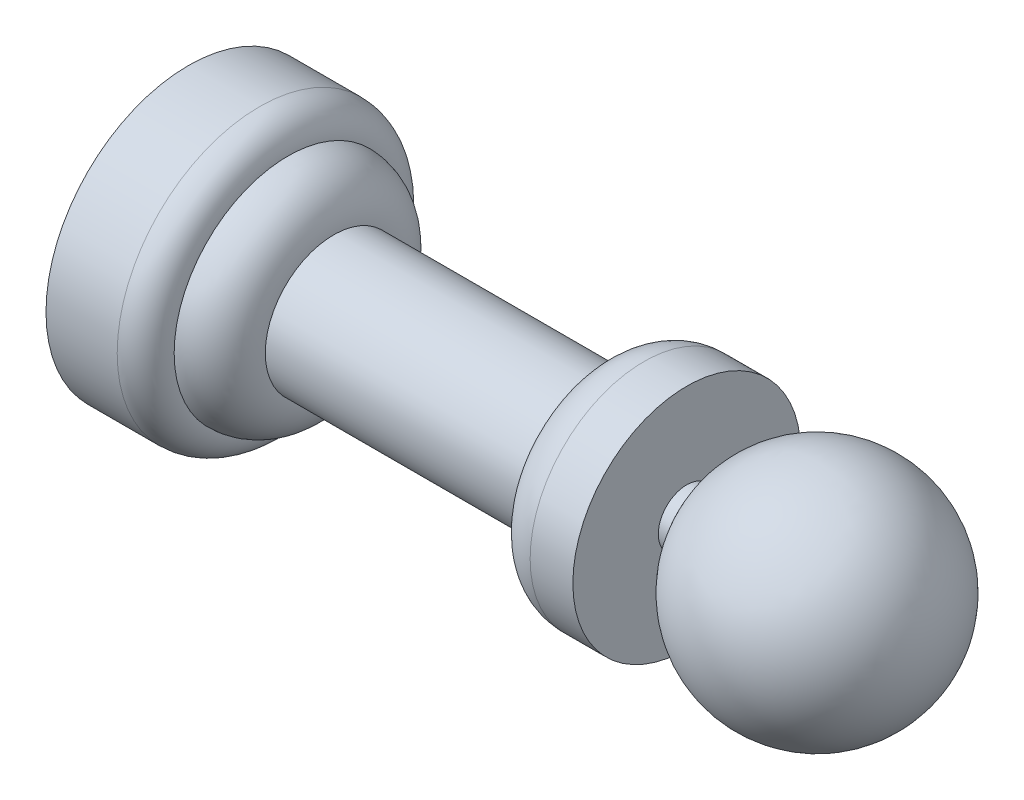
ISO-10303-21;
HEADER;
FILE_DESCRIPTION(('STEP AP214'),'2;1');
FILE_NAME('part.step','',(''),(''),'','','');
FILE_SCHEMA(('AUTOMOTIVE_DESIGN { 1 0 10303 214 1 1 1 1 }'));
ENDSEC;
DATA;
#1=APPLICATION_CONTEXT('core data for automotive mechanical design processes');
#2=APPLICATION_PROTOCOL_DEFINITION('international standard','automotive_design',2000,#1);
#3=PRODUCT_CONTEXT('',#1,'mechanical');
#4=PRODUCT('Part','Part','',(#3));
#5=PRODUCT_RELATED_PRODUCT_CATEGORY('part','',(#4));
#6=PRODUCT_DEFINITION_FORMATION('','',#4);
#7=PRODUCT_DEFINITION_CONTEXT('part definition',#1,'design');
#8=PRODUCT_DEFINITION('design','',#6,#7);
#9=PRODUCT_DEFINITION_SHAPE('','',#8);
#10=(LENGTH_UNIT() NAMED_UNIT(*) SI_UNIT(.MILLI.,.METRE.));
#11=(NAMED_UNIT(*) PLANE_ANGLE_UNIT() SI_UNIT($,.RADIAN.));
#12=(NAMED_UNIT(*) SI_UNIT($,.STERADIAN.) SOLID_ANGLE_UNIT());
#13=UNCERTAINTY_MEASURE_WITH_UNIT(LENGTH_MEASURE(1.E-05),#10,'distance_accuracy_value','');
#14=(GEOMETRIC_REPRESENTATION_CONTEXT(3) GLOBAL_UNCERTAINTY_ASSIGNED_CONTEXT((#13)) GLOBAL_UNIT_ASSIGNED_CONTEXT((#10,
#11,#12)) REPRESENTATION_CONTEXT('',''));
#15=CARTESIAN_POINT('',(0.,0.,0.));
#16=DIRECTION('',(0.,0.,1.));
#17=DIRECTION('',(1.,0.,0.));
#18=AXIS2_PLACEMENT_3D('',#15,#16,#17);
#19=CARTESIAN_POINT('',(32.,0.,0.));
#20=DIRECTION('',(-1.,0.,0.));
#21=DIRECTION('',(0.,0.,1.));
#22=AXIS2_PLACEMENT_3D('',#19,#20,#21);
#23=TOROIDAL_SURFACE('',#22,4.8,3.2);
#24=CARTESIAN_POINT('',(32.,0.,0.));
#25=DIRECTION('',(-1.,0.,0.));
#26=DIRECTION('',(0.,0.,1.));
#27=AXIS2_PLACEMENT_3D('',#24,#25,#26);
#28=CIRCLE('',#27,8.);
#29=CARTESIAN_POINT('',(32.,0.,8.));
#30=VERTEX_POINT('',#29);
#31=EDGE_CURVE('E92',#30,#30,#28,.T.);
#32=ORIENTED_EDGE('',*,*,#31,.T.);
#33=EDGE_LOOP('',(#32));
#34=FACE_BOUND('',#33,.T.);
#35=CARTESIAN_POINT('',(28.8,0.,0.));
#36=DIRECTION('',(-1.,0.,0.));
#37=DIRECTION('',(0.,0.,1.));
#38=AXIS2_PLACEMENT_3D('',#35,#36,#37);
#39=CIRCLE('',#38,4.8);
#40=CARTESIAN_POINT('',(28.8,0.,4.8));
#41=VERTEX_POINT('',#40);
#42=EDGE_CURVE('E10',#41,#41,#39,.T.);
#43=ORIENTED_EDGE('',*,*,#42,.F.);
#44=EDGE_LOOP('',(#43));
#45=FACE_BOUND('',#44,.T.);
#46=ADVANCED_FACE('F44',(#34,#45),#23,.T.);
#47=CARTESIAN_POINT('',(0.,0.,0.));
#48=DIRECTION('',(-1.,0.,0.));
#49=DIRECTION('',(0.,0.,1.));
#50=AXIS2_PLACEMENT_3D('',#47,#48,#49);
#51=CYLINDRICAL_SURFACE('',#50,4.8);
#52=ORIENTED_EDGE('',*,*,#42,.T.);
#53=EDGE_LOOP('',(#52));
#54=FACE_BOUND('',#53,.T.);
#55=CARTESIAN_POINT('',(10.2,0.,0.));
#56=DIRECTION('',(-1.,0.,0.));
#57=DIRECTION('',(0.,0.,1.));
#58=AXIS2_PLACEMENT_3D('',#55,#56,#57);
#59=CIRCLE('',#58,4.8);
#60=CARTESIAN_POINT('',(10.2,0.,4.8));
#61=VERTEX_POINT('',#60);
#62=EDGE_CURVE('E52',#61,#61,#59,.T.);
#63=ORIENTED_EDGE('',*,*,#62,.F.);
#64=EDGE_LOOP('',(#63));
#65=FACE_BOUND('',#64,.T.);
#66=ADVANCED_FACE('F112',(#54,#65),#51,.T.);
#67=CARTESIAN_POINT('',(7.,0.,0.));
#68=DIRECTION('',(-1.,0.,0.));
#69=DIRECTION('',(0.,0.,1.));
#70=AXIS2_PLACEMENT_3D('',#67,#68,#69);
#71=TOROIDAL_SURFACE('',#70,4.8,3.2);
#72=ORIENTED_EDGE('',*,*,#62,.T.);
#73=EDGE_LOOP('',(#72));
#74=FACE_BOUND('',#73,.T.);
#75=CARTESIAN_POINT('',(7.,0.,0.));
#76=DIRECTION('',(-1.,0.,0.));
#77=DIRECTION('',(0.,0.,1.));
#78=AXIS2_PLACEMENT_3D('',#75,#76,#77);
#79=CIRCLE('',#78,8.);
#80=CARTESIAN_POINT('',(7.,0.,8.));
#81=VERTEX_POINT('',#80);
#82=EDGE_CURVE('E57',#81,#81,#79,.T.);
#83=ORIENTED_EDGE('',*,*,#82,.F.);
#84=EDGE_LOOP('',(#83));
#85=FACE_BOUND('',#84,.T.);
#86=ADVANCED_FACE('F116',(#74,#85),#71,.T.);
#87=CARTESIAN_POINT('',(5.,0.,0.));
#88=DIRECTION('',(-1.,0.,0.));
#89=DIRECTION('',(0.,0.,1.));
#90=AXIS2_PLACEMENT_3D('',#87,#88,#89);
#91=TOROIDAL_SURFACE('',#90,8.,2.);
#92=ORIENTED_EDGE('',*,*,#82,.T.);
#93=EDGE_LOOP('',(#92));
#94=FACE_BOUND('',#93,.T.);
#95=CARTESIAN_POINT('',(5.,0.,0.));
#96=DIRECTION('',(-1.,0.,0.));
#97=DIRECTION('',(0.,0.,1.));
#98=AXIS2_PLACEMENT_3D('',#95,#96,#97);
#99=CIRCLE('',#98,10.);
#100=CARTESIAN_POINT('',(5.,0.,10.));
#101=VERTEX_POINT('',#100);
#102=EDGE_CURVE('E62',#101,#101,#99,.T.);
#103=ORIENTED_EDGE('',*,*,#102,.F.);
#104=EDGE_LOOP('',(#103));
#105=FACE_BOUND('',#104,.T.);
#106=ADVANCED_FACE('F120',(#94,#105),#91,.T.);
#107=CARTESIAN_POINT('',(0.,0.,0.));
#108=DIRECTION('',(-1.,0.,0.));
#109=DIRECTION('',(0.,0.,1.));
#110=AXIS2_PLACEMENT_3D('',#107,#108,#109);
#111=CYLINDRICAL_SURFACE('',#110,10.);
#112=ORIENTED_EDGE('',*,*,#102,.T.);
#113=EDGE_LOOP('',(#112));
#114=FACE_BOUND('',#113,.T.);
#115=CARTESIAN_POINT('',(0.,0.,0.));
#116=DIRECTION('',(-1.,0.,0.));
#117=DIRECTION('',(0.,0.,1.));
#118=AXIS2_PLACEMENT_3D('',#115,#116,#117);
#119=CIRCLE('',#118,10.);
#120=CARTESIAN_POINT('',(0.,0.,10.));
#121=VERTEX_POINT('',#120);
#122=EDGE_CURVE('E68',#121,#121,#119,.T.);
#123=ORIENTED_EDGE('',*,*,#122,.F.);
#124=EDGE_LOOP('',(#123));
#125=FACE_BOUND('',#124,.T.);
#126=ADVANCED_FACE('F126',(#114,#125),#111,.T.);
#127=CARTESIAN_POINT('',(0.,0.,0.));
#128=DIRECTION('',(-1.,0.,0.));
#129=DIRECTION('',(0.,0.,1.));
#130=AXIS2_PLACEMENT_3D('',#127,#128,#129);
#131=PLANE('',#130);
#132=ORIENTED_EDGE('',*,*,#122,.T.);
#133=EDGE_LOOP('',(#132));
#134=FACE_BOUND('',#133,.T.);
#135=ADVANCED_FACE('F130',(#134),#131,.T.);
#136=CARTESIAN_POINT('',(44.1459666924148,0.,0.));
#137=DIRECTION('',(-1.,0.,0.));
#138=DIRECTION('',(0.,1.,0.));
#139=AXIS2_PLACEMENT_3D('',#136,#137,#138);
#140=SPHERICAL_SURFACE('',#139,8.);
#141=CARTESIAN_POINT('',(36.4,0.,0.));
#142=DIRECTION('',(-1.,0.,0.));
#143=DIRECTION('',(0.,0.,1.));
#144=AXIS2_PLACEMENT_3D('',#141,#142,#143);
#145=CIRCLE('',#144,2.);
#146=CARTESIAN_POINT('',(36.4,0.,2.));
#147=VERTEX_POINT('',#146);
#148=EDGE_CURVE('E80',#147,#147,#145,.T.);
#149=ORIENTED_EDGE('',*,*,#148,.F.);
#150=EDGE_LOOP('',(#149));
#151=FACE_BOUND('',#150,.T.);
#152=ADVANCED_FACE('F134',(#151),#140,.T.);
#153=CARTESIAN_POINT('',(0.,0.,0.));
#154=DIRECTION('',(-1.,0.,0.));
#155=DIRECTION('',(0.,0.,1.));
#156=AXIS2_PLACEMENT_3D('',#153,#154,#155);
#157=CYLINDRICAL_SURFACE('',#156,2.);
#158=ORIENTED_EDGE('',*,*,#148,.T.);
#159=EDGE_LOOP('',(#158));
#160=FACE_BOUND('',#159,.T.);
#161=CARTESIAN_POINT('',(35.,0.,0.));
#162=DIRECTION('',(-1.,0.,0.));
#163=DIRECTION('',(0.,0.,1.));
#164=AXIS2_PLACEMENT_3D('',#161,#162,#163);
#165=CIRCLE('',#164,2.);
#166=CARTESIAN_POINT('',(35.,0.,2.));
#167=VERTEX_POINT('',#166);
#168=EDGE_CURVE('E84',#167,#167,#165,.T.);
#169=ORIENTED_EDGE('',*,*,#168,.F.);
#170=EDGE_LOOP('',(#169));
#171=FACE_BOUND('',#170,.T.);
#172=ADVANCED_FACE('F108',(#160,#171),#157,.T.);
#173=CARTESIAN_POINT('',(35.,0.,0.));
#174=DIRECTION('',(1.,0.,0.));
#175=DIRECTION('',(0.,0.,-1.));
#176=AXIS2_PLACEMENT_3D('',#173,#174,#175);
#177=PLANE('',#176);
#178=ORIENTED_EDGE('',*,*,#168,.T.);
#179=EDGE_LOOP('',(#178));
#180=FACE_BOUND('',#179,.T.);
#181=CARTESIAN_POINT('',(35.,0.,0.));
#182=DIRECTION('',(-1.,0.,0.));
#183=DIRECTION('',(0.,0.,1.));
#184=AXIS2_PLACEMENT_3D('',#181,#182,#183);
#185=CIRCLE('',#184,8.);
#186=CARTESIAN_POINT('',(35.,0.,8.));
#187=VERTEX_POINT('',#186);
#188=EDGE_CURVE('E88',#187,#187,#185,.T.);
#189=ORIENTED_EDGE('',*,*,#188,.F.);
#190=EDGE_LOOP('',(#189));
#191=FACE_BOUND('',#190,.T.);
#192=ADVANCED_FACE('F101',(#180,#191),#177,.T.);
#193=CARTESIAN_POINT('',(0.,0.,0.));
#194=DIRECTION('',(-1.,0.,0.));
#195=DIRECTION('',(0.,0.,1.));
#196=AXIS2_PLACEMENT_3D('',#193,#194,#195);
#197=CYLINDRICAL_SURFACE('',#196,8.);
#198=ORIENTED_EDGE('',*,*,#188,.T.);
#199=EDGE_LOOP('',(#198));
#200=FACE_BOUND('',#199,.T.);
#201=ORIENTED_EDGE('',*,*,#31,.F.);
#202=EDGE_LOOP('',(#201));
#203=FACE_BOUND('',#202,.T.);
#204=ADVANCED_FACE('F99',(#200,#203),#197,.T.);
#205=CLOSED_SHELL('',(#46,#66,#86,#106,#126,#135,#152,#172,#192,#204));
#206=CARTESIAN_POINT('',(1.,0.,0.));
#207=DIRECTION('',(-1.,0.,0.));
#208=DIRECTION('',(0.,0.,1.));
#209=AXIS2_PLACEMENT_3D('',#206,#207,#208);
#210=PLANE('',#209);
#211=CARTESIAN_POINT('',(1.,0.,0.));
#212=DIRECTION('',(-1.,0.,0.));
#213=DIRECTION('',(0.,0.,1.));
#214=AXIS2_PLACEMENT_3D('',#211,#212,#213);
#215=CIRCLE('',#214,5.25);
#216=CARTESIAN_POINT('',(1.,0.,5.25));
#217=VERTEX_POINT('',#216);
#218=EDGE_CURVE('E72',#217,#217,#215,.T.);
#219=ORIENTED_EDGE('',*,*,#218,.F.);
#220=EDGE_LOOP('',(#219));
#221=FACE_BOUND('',#220,.T.);
#222=ADVANCED_FACE('F136',(#221),#210,.F.);
#223=CARTESIAN_POINT('',(0.,0.,0.));
#224=DIRECTION('',(-1.,0.,0.));
#225=DIRECTION('',(0.,0.,1.));
#226=AXIS2_PLACEMENT_3D('',#223,#224,#225);
#227=CYLINDRICAL_SURFACE('',#226,5.25);
#228=CARTESIAN_POINT('',(3.5,0.,0.));
#229=DIRECTION('',(-1.,0.,0.));
#230=DIRECTION('',(0.,0.,1.));
#231=AXIS2_PLACEMENT_3D('',#228,#229,#230);
#232=CIRCLE('',#231,5.25);
#233=CARTESIAN_POINT('',(3.5,0.,5.25));
#234=VERTEX_POINT('',#233);
#235=EDGE_CURVE('E76',#234,#234,#232,.T.);
#236=ORIENTED_EDGE('',*,*,#235,.F.);
#237=EDGE_LOOP('',(#236));
#238=FACE_BOUND('',#237,.T.);
#239=ORIENTED_EDGE('',*,*,#218,.T.);
#240=EDGE_LOOP('',(#239));
#241=FACE_BOUND('',#240,.T.);
#242=ADVANCED_FACE('F138',(#238,#241),#227,.F.);
#243=CARTESIAN_POINT('',(3.5,0.,0.));
#244=DIRECTION('',(1.,0.,0.));
#245=DIRECTION('',(0.,0.,-1.));
#246=AXIS2_PLACEMENT_3D('',#243,#244,#245);
#247=PLANE('',#246);
#248=ORIENTED_EDGE('',*,*,#235,.T.);
#249=EDGE_LOOP('',(#248));
#250=FACE_BOUND('',#249,.T.);
#251=ADVANCED_FACE('F143',(#250),#247,.F.);
#252=CLOSED_SHELL('',(#222,#242,#251));
#253=ORIENTED_CLOSED_SHELL('',*,#252,.T.);
#254=BREP_WITH_VOIDS('B2',#205,(#253));
#255=ADVANCED_BREP_SHAPE_REPRESENTATION('',(#18,#254),#14);
#256=SHAPE_DEFINITION_REPRESENTATION(#9,#255);
ENDSEC;
END-ISO-10303-21;
